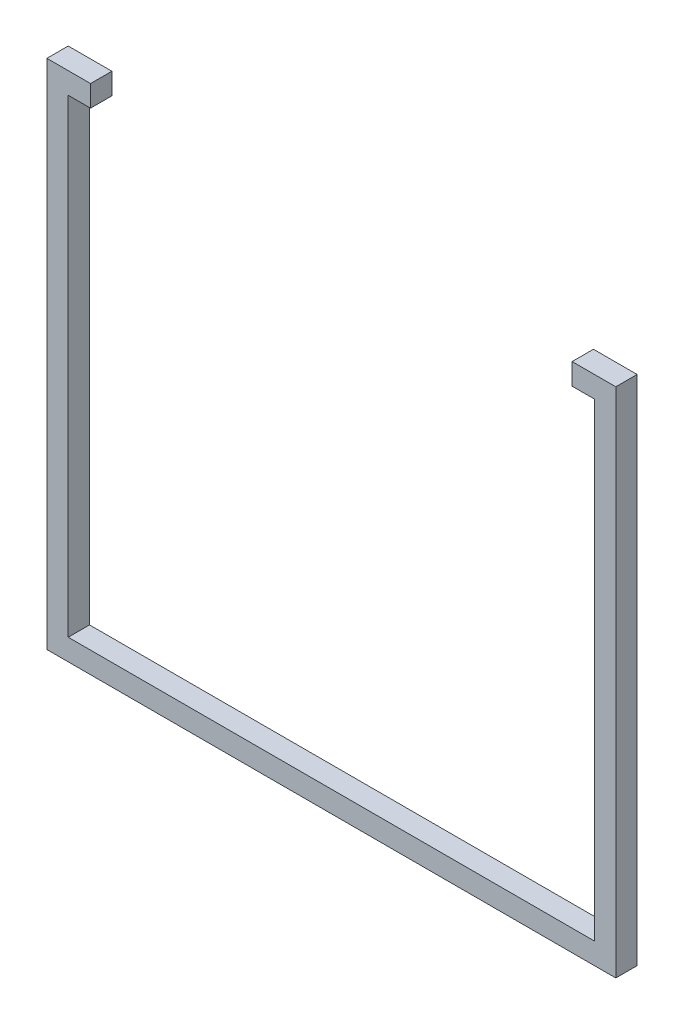
ISO-10303-21;
HEADER;
FILE_DESCRIPTION(('STEP AP214'),'2;1');
FILE_NAME('part.step','',(''),(''),'','','');
FILE_SCHEMA(('AUTOMOTIVE_DESIGN { 1 0 10303 214 1 1 1 1 }'));
ENDSEC;
DATA;
#1=APPLICATION_CONTEXT('core data for automotive mechanical design processes');
#2=APPLICATION_PROTOCOL_DEFINITION('international standard','automotive_design',2000,#1);
#3=PRODUCT_CONTEXT('',#1,'mechanical');
#4=PRODUCT('Part','Part','',(#3));
#5=PRODUCT_RELATED_PRODUCT_CATEGORY('part','',(#4));
#6=PRODUCT_DEFINITION_FORMATION('','',#4);
#7=PRODUCT_DEFINITION_CONTEXT('part definition',#1,'design');
#8=PRODUCT_DEFINITION('design','',#6,#7);
#9=PRODUCT_DEFINITION_SHAPE('','',#8);
#10=(LENGTH_UNIT() NAMED_UNIT(*) SI_UNIT(.MILLI.,.METRE.));
#11=(NAMED_UNIT(*) PLANE_ANGLE_UNIT() SI_UNIT($,.RADIAN.));
#12=(NAMED_UNIT(*) SI_UNIT($,.STERADIAN.) SOLID_ANGLE_UNIT());
#13=UNCERTAINTY_MEASURE_WITH_UNIT(LENGTH_MEASURE(1.E-05),#10,'distance_accuracy_value','');
#14=(GEOMETRIC_REPRESENTATION_CONTEXT(3) GLOBAL_UNCERTAINTY_ASSIGNED_CONTEXT((#13)) GLOBAL_UNIT_ASSIGNED_CONTEXT((#10,
#11,#12)) REPRESENTATION_CONTEXT('',''));
#15=CARTESIAN_POINT('',(0.,0.,0.));
#16=DIRECTION('',(0.,0.,1.));
#17=DIRECTION('',(1.,0.,0.));
#18=AXIS2_PLACEMENT_3D('',#15,#16,#17);
#19=CARTESIAN_POINT('',(0.,457.2,19.05));
#20=DIRECTION('',(0.,-1.,0.));
#21=DIRECTION('',(0.,0.,-1.));
#22=AXIS2_PLACEMENT_3D('',#19,#20,#21);
#23=PLANE('',#22);
#24=DIRECTION('',(-1.,0.,0.));
#25=VECTOR('',#24,1.);
#26=CARTESIAN_POINT('',(0.,457.2,0.));
#27=LINE('',#26,#25);
#28=CARTESIAN_POINT('',(508.,457.2,0.));
#29=VERTEX_POINT('',#28);
#30=CARTESIAN_POINT('',(469.,457.2,0.));
#31=VERTEX_POINT('',#30);
#32=EDGE_CURVE('E136',#29,#31,#27,.T.);
#33=ORIENTED_EDGE('',*,*,#32,.T.);
#34=DIRECTION('',(0.,0.,1.));
#35=VECTOR('',#34,1.);
#36=CARTESIAN_POINT('',(469.,457.2,0.));
#37=LINE('',#36,#35);
#38=CARTESIAN_POINT('',(469.,457.2,19.05));
#39=VERTEX_POINT('',#38);
#40=EDGE_CURVE('E120',#31,#39,#37,.T.);
#41=ORIENTED_EDGE('',*,*,#40,.T.);
#42=DIRECTION('',(-1.,0.,0.));
#43=VECTOR('',#42,1.);
#44=CARTESIAN_POINT('',(0.,457.2,19.05));
#45=LINE('',#44,#43);
#46=CARTESIAN_POINT('',(508.,457.2,19.05));
#47=VERTEX_POINT('',#46);
#48=EDGE_CURVE('E157',#47,#39,#45,.T.);
#49=ORIENTED_EDGE('',*,*,#48,.F.);
#50=DIRECTION('',(0.,0.,-1.));
#51=VECTOR('',#50,1.);
#52=CARTESIAN_POINT('',(508.,457.2,19.05));
#53=LINE('',#52,#51);
#54=EDGE_CURVE('E143',#47,#29,#53,.T.);
#55=ORIENTED_EDGE('',*,*,#54,.T.);
#56=EDGE_LOOP('',(#33,#41,#49,#55));
#57=FACE_BOUND('',#56,.T.);
#58=ADVANCED_FACE('F33',(#57),#23,.F.);
#59=CARTESIAN_POINT('',(19.05,438.15,19.05));
#60=DIRECTION('',(0.,-1.,0.));
#61=DIRECTION('',(0.,0.,-1.));
#62=AXIS2_PLACEMENT_3D('',#59,#60,#61);
#63=PLANE('',#62);
#64=DIRECTION('',(0.,0.,1.));
#65=VECTOR('',#64,1.);
#66=CARTESIAN_POINT('',(469.,438.15,0.));
#67=LINE('',#66,#65);
#68=CARTESIAN_POINT('',(469.,438.15,0.));
#69=VERTEX_POINT('',#68);
#70=CARTESIAN_POINT('',(469.,438.15,19.05));
#71=VERTEX_POINT('',#70);
#72=EDGE_CURVE('E197',#69,#71,#67,.T.);
#73=ORIENTED_EDGE('',*,*,#72,.F.);
#74=DIRECTION('',(-1.,0.,0.));
#75=VECTOR('',#74,1.);
#76=CARTESIAN_POINT('',(19.05,438.15,0.));
#77=LINE('',#76,#75);
#78=CARTESIAN_POINT('',(488.95,438.15,0.));
#79=VERTEX_POINT('',#78);
#80=EDGE_CURVE('E139',#79,#69,#77,.T.);
#81=ORIENTED_EDGE('',*,*,#80,.F.);
#82=DIRECTION('',(0.,0.,-1.));
#83=VECTOR('',#82,1.);
#84=CARTESIAN_POINT('',(488.95,438.15,19.05));
#85=LINE('',#84,#83);
#86=CARTESIAN_POINT('',(488.95,438.15,19.05));
#87=VERTEX_POINT('',#86);
#88=EDGE_CURVE('E180',#87,#79,#85,.T.);
#89=ORIENTED_EDGE('',*,*,#88,.F.);
#90=DIRECTION('',(-1.,0.,0.));
#91=VECTOR('',#90,1.);
#92=CARTESIAN_POINT('',(19.05,438.15,19.05));
#93=LINE('',#92,#91);
#94=EDGE_CURVE('E185',#87,#71,#93,.T.);
#95=ORIENTED_EDGE('',*,*,#94,.T.);
#96=EDGE_LOOP('',(#73,#81,#89,#95));
#97=FACE_BOUND('',#96,.T.);
#98=ADVANCED_FACE('F238',(#97),#63,.T.);
#99=CARTESIAN_POINT('',(0.,0.,19.05));
#100=DIRECTION('',(0.,0.,-1.));
#101=DIRECTION('',(-1.,0.,0.));
#102=AXIS2_PLACEMENT_3D('',#99,#100,#101);
#103=PLANE('',#102);
#104=ORIENTED_EDGE('',*,*,#48,.T.);
#105=DIRECTION('',(0.,1.,0.));
#106=VECTOR('',#105,1.);
#107=CARTESIAN_POINT('',(469.,457.2,19.05));
#108=LINE('',#107,#106);
#109=EDGE_CURVE('E123',#71,#39,#108,.T.);
#110=ORIENTED_EDGE('',*,*,#109,.F.);
#111=ORIENTED_EDGE('',*,*,#94,.F.);
#112=DIRECTION('',(0.,1.,0.));
#113=VECTOR('',#112,1.);
#114=CARTESIAN_POINT('',(488.95,19.05,19.05));
#115=LINE('',#114,#113);
#116=CARTESIAN_POINT('',(488.95,19.05,19.05));
#117=VERTEX_POINT('',#116);
#118=EDGE_CURVE('E201',#117,#87,#115,.T.);
#119=ORIENTED_EDGE('',*,*,#118,.F.);
#120=DIRECTION('',(1.,0.,0.));
#121=VECTOR('',#120,1.);
#122=CARTESIAN_POINT('',(19.05,19.05,19.05));
#123=LINE('',#122,#121);
#124=CARTESIAN_POINT('',(19.05,19.05,19.05));
#125=VERTEX_POINT('',#124);
#126=EDGE_CURVE('E204',#125,#117,#123,.T.);
#127=ORIENTED_EDGE('',*,*,#126,.F.);
#128=DIRECTION('',(0.,-1.,0.));
#129=VECTOR('',#128,1.);
#130=CARTESIAN_POINT('',(19.05,19.05,19.05));
#131=LINE('',#130,#129);
#132=CARTESIAN_POINT('',(19.05,438.15,19.05));
#133=VERTEX_POINT('',#132);
#134=EDGE_CURVE('E187',#133,#125,#131,.T.);
#135=ORIENTED_EDGE('',*,*,#134,.F.);
#136=CARTESIAN_POINT('',(39.,438.15,19.05));
#137=VERTEX_POINT('',#136);
#138=EDGE_CURVE('E200',#137,#133,#93,.T.);
#139=ORIENTED_EDGE('',*,*,#138,.F.);
#140=DIRECTION('',(0.,-1.,0.));
#141=VECTOR('',#140,1.);
#142=CARTESIAN_POINT('',(39.,457.2,19.05));
#143=LINE('',#142,#141);
#144=CARTESIAN_POINT('',(39.,457.2,19.05));
#145=VERTEX_POINT('',#144);
#146=EDGE_CURVE('E48',#145,#137,#143,.T.);
#147=ORIENTED_EDGE('',*,*,#146,.F.);
#148=CARTESIAN_POINT('',(0.,457.2,19.05));
#149=VERTEX_POINT('',#148);
#150=EDGE_CURVE('E173',#145,#149,#45,.T.);
#151=ORIENTED_EDGE('',*,*,#150,.T.);
#152=DIRECTION('',(0.,-1.,0.));
#153=VECTOR('',#152,1.);
#154=CARTESIAN_POINT('',(0.,0.,19.05));
#155=LINE('',#154,#153);
#156=CARTESIAN_POINT('',(0.,0.,19.05));
#157=VERTEX_POINT('',#156);
#158=EDGE_CURVE('E144',#149,#157,#155,.T.);
#159=ORIENTED_EDGE('',*,*,#158,.T.);
#160=DIRECTION('',(1.,0.,0.));
#161=VECTOR('',#160,1.);
#162=CARTESIAN_POINT('',(0.,0.,19.05));
#163=LINE('',#162,#161);
#164=CARTESIAN_POINT('',(508.,0.,19.05));
#165=VERTEX_POINT('',#164);
#166=EDGE_CURVE('E148',#157,#165,#163,.T.);
#167=ORIENTED_EDGE('',*,*,#166,.T.);
#168=DIRECTION('',(0.,1.,0.));
#169=VECTOR('',#168,1.);
#170=CARTESIAN_POINT('',(508.,0.,19.05));
#171=LINE('',#170,#169);
#172=EDGE_CURVE('E163',#165,#47,#171,.T.);
#173=ORIENTED_EDGE('',*,*,#172,.T.);
#174=EDGE_LOOP('',(#104,#110,#111,#119,#127,#135,#139,#147,#151,#159,#167,#173));
#175=FACE_BOUND('',#174,.T.);
#176=ADVANCED_FACE('F228',(#175),#103,.F.);
#177=CARTESIAN_POINT('',(0.,0.,0.));
#178=DIRECTION('',(0.,0.,-1.));
#179=DIRECTION('',(-1.,0.,0.));
#180=AXIS2_PLACEMENT_3D('',#177,#178,#179);
#181=PLANE('',#180);
#182=DIRECTION('',(0.,1.,0.));
#183=VECTOR('',#182,1.);
#184=CARTESIAN_POINT('',(469.,457.2,0.));
#185=LINE('',#184,#183);
#186=EDGE_CURVE('E56',#69,#31,#185,.T.);
#187=ORIENTED_EDGE('',*,*,#186,.T.);
#188=ORIENTED_EDGE('',*,*,#32,.F.);
#189=DIRECTION('',(0.,1.,0.));
#190=VECTOR('',#189,1.);
#191=CARTESIAN_POINT('',(508.,0.,0.));
#192=LINE('',#191,#190);
#193=CARTESIAN_POINT('',(508.,0.,0.));
#194=VERTEX_POINT('',#193);
#195=EDGE_CURVE('E150',#194,#29,#192,.T.);
#196=ORIENTED_EDGE('',*,*,#195,.F.);
#197=DIRECTION('',(1.,0.,0.));
#198=VECTOR('',#197,1.);
#199=CARTESIAN_POINT('',(0.,0.,0.));
#200=LINE('',#199,#198);
#201=CARTESIAN_POINT('',(0.,0.,0.));
#202=VERTEX_POINT('',#201);
#203=EDGE_CURVE('E166',#202,#194,#200,.T.);
#204=ORIENTED_EDGE('',*,*,#203,.F.);
#205=DIRECTION('',(0.,-1.,0.));
#206=VECTOR('',#205,1.);
#207=CARTESIAN_POINT('',(0.,0.,0.));
#208=LINE('',#207,#206);
#209=CARTESIAN_POINT('',(0.,457.2,0.));
#210=VERTEX_POINT('',#209);
#211=EDGE_CURVE('E167',#210,#202,#208,.T.);
#212=ORIENTED_EDGE('',*,*,#211,.F.);
#213=CARTESIAN_POINT('',(39.,457.2,0.));
#214=VERTEX_POINT('',#213);
#215=EDGE_CURVE('E145',#214,#210,#27,.T.);
#216=ORIENTED_EDGE('',*,*,#215,.F.);
#217=DIRECTION('',(0.,-1.,0.));
#218=VECTOR('',#217,1.);
#219=CARTESIAN_POINT('',(39.,457.2,0.));
#220=LINE('',#219,#218);
#221=CARTESIAN_POINT('',(39.,438.15,0.));
#222=VERTEX_POINT('',#221);
#223=EDGE_CURVE('E129',#214,#222,#220,.T.);
#224=ORIENTED_EDGE('',*,*,#223,.T.);
#225=CARTESIAN_POINT('',(19.05,438.15,0.));
#226=VERTEX_POINT('',#225);
#227=EDGE_CURVE('E188',#222,#226,#77,.T.);
#228=ORIENTED_EDGE('',*,*,#227,.T.);
#229=DIRECTION('',(0.,-1.,0.));
#230=VECTOR('',#229,1.);
#231=CARTESIAN_POINT('',(19.05,19.05,0.));
#232=LINE('',#231,#230);
#233=CARTESIAN_POINT('',(19.05,19.05,0.));
#234=VERTEX_POINT('',#233);
#235=EDGE_CURVE('E194',#226,#234,#232,.T.);
#236=ORIENTED_EDGE('',*,*,#235,.T.);
#237=DIRECTION('',(1.,0.,0.));
#238=VECTOR('',#237,1.);
#239=CARTESIAN_POINT('',(19.05,19.05,0.));
#240=LINE('',#239,#238);
#241=CARTESIAN_POINT('',(488.95,19.05,0.));
#242=VERTEX_POINT('',#241);
#243=EDGE_CURVE('E191',#234,#242,#240,.T.);
#244=ORIENTED_EDGE('',*,*,#243,.T.);
#245=DIRECTION('',(0.,1.,0.));
#246=VECTOR('',#245,1.);
#247=CARTESIAN_POINT('',(488.95,19.05,0.));
#248=LINE('',#247,#246);
#249=EDGE_CURVE('E189',#242,#79,#248,.T.);
#250=ORIENTED_EDGE('',*,*,#249,.T.);
#251=ORIENTED_EDGE('',*,*,#80,.T.);
#252=EDGE_LOOP('',(#187,#188,#196,#204,#212,#216,#224,#228,#236,#244,#250,#251));
#253=FACE_BOUND('',#252,.T.);
#254=ADVANCED_FACE('F134',(#253),#181,.T.);
#255=CARTESIAN_POINT('',(0.,0.,19.05));
#256=DIRECTION('',(1.,0.,0.));
#257=DIRECTION('',(0.,0.,-1.));
#258=AXIS2_PLACEMENT_3D('',#255,#256,#257);
#259=PLANE('',#258);
#260=ORIENTED_EDGE('',*,*,#211,.T.);
#261=DIRECTION('',(0.,0.,-1.));
#262=VECTOR('',#261,1.);
#263=CARTESIAN_POINT('',(0.,0.,19.05));
#264=LINE('',#263,#262);
#265=EDGE_CURVE('E11',#157,#202,#264,.T.);
#266=ORIENTED_EDGE('',*,*,#265,.F.);
#267=ORIENTED_EDGE('',*,*,#158,.F.);
#268=DIRECTION('',(0.,0.,-1.));
#269=VECTOR('',#268,1.);
#270=CARTESIAN_POINT('',(0.,457.2,19.05));
#271=LINE('',#270,#269);
#272=EDGE_CURVE('E154',#149,#210,#271,.T.);
#273=ORIENTED_EDGE('',*,*,#272,.T.);
#274=EDGE_LOOP('',(#260,#266,#267,#273));
#275=FACE_BOUND('',#274,.T.);
#276=ADVANCED_FACE('F35',(#275),#259,.F.);
#277=CARTESIAN_POINT('',(0.,0.,19.05));
#278=DIRECTION('',(0.,1.,0.));
#279=DIRECTION('',(0.,0.,1.));
#280=AXIS2_PLACEMENT_3D('',#277,#278,#279);
#281=PLANE('',#280);
#282=ORIENTED_EDGE('',*,*,#203,.T.);
#283=DIRECTION('',(0.,0.,-1.));
#284=VECTOR('',#283,1.);
#285=CARTESIAN_POINT('',(508.,0.,19.05));
#286=LINE('',#285,#284);
#287=EDGE_CURVE('E41',#165,#194,#286,.T.);
#288=ORIENTED_EDGE('',*,*,#287,.F.);
#289=ORIENTED_EDGE('',*,*,#166,.F.);
#290=ORIENTED_EDGE('',*,*,#265,.T.);
#291=EDGE_LOOP('',(#282,#288,#289,#290));
#292=FACE_BOUND('',#291,.T.);
#293=ADVANCED_FACE('F241',(#292),#281,.F.);
#294=CARTESIAN_POINT('',(508.,0.,19.05));
#295=DIRECTION('',(-1.,0.,0.));
#296=DIRECTION('',(0.,0.,1.));
#297=AXIS2_PLACEMENT_3D('',#294,#295,#296);
#298=PLANE('',#297);
#299=ORIENTED_EDGE('',*,*,#195,.T.);
#300=ORIENTED_EDGE('',*,*,#54,.F.);
#301=ORIENTED_EDGE('',*,*,#172,.F.);
#302=ORIENTED_EDGE('',*,*,#287,.T.);
#303=EDGE_LOOP('',(#299,#300,#301,#302));
#304=FACE_BOUND('',#303,.T.);
#305=ADVANCED_FACE('F162',(#304),#298,.F.);
#306=ORIENTED_EDGE('',*,*,#150,.F.);
#307=DIRECTION('',(0.,0.,1.));
#308=VECTOR('',#307,1.);
#309=CARTESIAN_POINT('',(39.,457.2,0.));
#310=LINE('',#309,#308);
#311=EDGE_CURVE('E128',#214,#145,#310,.T.);
#312=ORIENTED_EDGE('',*,*,#311,.F.);
#313=ORIENTED_EDGE('',*,*,#215,.T.);
#314=ORIENTED_EDGE('',*,*,#272,.F.);
#315=EDGE_LOOP('',(#306,#312,#313,#314));
#316=FACE_BOUND('',#315,.T.);
#317=ADVANCED_FACE('F246',(#316),#23,.F.);
#318=CARTESIAN_POINT('',(19.05,19.05,19.05));
#319=DIRECTION('',(1.,0.,0.));
#320=DIRECTION('',(0.,0.,-1.));
#321=AXIS2_PLACEMENT_3D('',#318,#319,#320);
#322=PLANE('',#321);
#323=ORIENTED_EDGE('',*,*,#235,.F.);
#324=DIRECTION('',(0.,0.,-1.));
#325=VECTOR('',#324,1.);
#326=CARTESIAN_POINT('',(19.05,438.15,19.05));
#327=LINE('',#326,#325);
#328=EDGE_CURVE('E182',#133,#226,#327,.T.);
#329=ORIENTED_EDGE('',*,*,#328,.F.);
#330=ORIENTED_EDGE('',*,*,#134,.T.);
#331=DIRECTION('',(0.,0.,-1.));
#332=VECTOR('',#331,1.);
#333=CARTESIAN_POINT('',(19.05,19.05,19.05));
#334=LINE('',#333,#332);
#335=EDGE_CURVE('E169',#125,#234,#334,.T.);
#336=ORIENTED_EDGE('',*,*,#335,.T.);
#337=EDGE_LOOP('',(#323,#329,#330,#336));
#338=FACE_BOUND('',#337,.T.);
#339=ADVANCED_FACE('F224',(#338),#322,.T.);
#340=CARTESIAN_POINT('',(19.05,19.05,19.05));
#341=DIRECTION('',(0.,1.,0.));
#342=DIRECTION('',(0.,0.,1.));
#343=AXIS2_PLACEMENT_3D('',#340,#341,#342);
#344=PLANE('',#343);
#345=ORIENTED_EDGE('',*,*,#243,.F.);
#346=ORIENTED_EDGE('',*,*,#335,.F.);
#347=ORIENTED_EDGE('',*,*,#126,.T.);
#348=DIRECTION('',(0.,0.,-1.));
#349=VECTOR('',#348,1.);
#350=CARTESIAN_POINT('',(488.95,19.05,19.05));
#351=LINE('',#350,#349);
#352=EDGE_CURVE('E178',#117,#242,#351,.T.);
#353=ORIENTED_EDGE('',*,*,#352,.T.);
#354=EDGE_LOOP('',(#345,#346,#347,#353));
#355=FACE_BOUND('',#354,.T.);
#356=ADVANCED_FACE('F233',(#355),#344,.T.);
#357=CARTESIAN_POINT('',(488.95,19.05,19.05));
#358=DIRECTION('',(-1.,0.,0.));
#359=DIRECTION('',(0.,0.,1.));
#360=AXIS2_PLACEMENT_3D('',#357,#358,#359);
#361=PLANE('',#360);
#362=ORIENTED_EDGE('',*,*,#249,.F.);
#363=ORIENTED_EDGE('',*,*,#352,.F.);
#364=ORIENTED_EDGE('',*,*,#118,.T.);
#365=ORIENTED_EDGE('',*,*,#88,.T.);
#366=EDGE_LOOP('',(#362,#363,#364,#365));
#367=FACE_BOUND('',#366,.T.);
#368=ADVANCED_FACE('F236',(#367),#361,.T.);
#369=DIRECTION('',(0.,0.,1.));
#370=VECTOR('',#369,1.);
#371=CARTESIAN_POINT('',(39.,438.15,0.));
#372=LINE('',#371,#370);
#373=EDGE_CURVE('E208',#222,#137,#372,.T.);
#374=ORIENTED_EDGE('',*,*,#373,.T.);
#375=ORIENTED_EDGE('',*,*,#138,.T.);
#376=ORIENTED_EDGE('',*,*,#328,.T.);
#377=ORIENTED_EDGE('',*,*,#227,.F.);
#378=EDGE_LOOP('',(#374,#375,#376,#377));
#379=FACE_BOUND('',#378,.T.);
#380=ADVANCED_FACE('F219',(#379),#63,.T.);
#381=CARTESIAN_POINT('',(39.,457.2,0.));
#382=DIRECTION('',(-1.,0.,0.));
#383=DIRECTION('',(0.,0.,1.));
#384=AXIS2_PLACEMENT_3D('',#381,#382,#383);
#385=PLANE('',#384);
#386=ORIENTED_EDGE('',*,*,#146,.T.);
#387=ORIENTED_EDGE('',*,*,#373,.F.);
#388=ORIENTED_EDGE('',*,*,#223,.F.);
#389=ORIENTED_EDGE('',*,*,#311,.T.);
#390=EDGE_LOOP('',(#386,#387,#388,#389));
#391=FACE_BOUND('',#390,.T.);
#392=ADVANCED_FACE('F247',(#391),#385,.F.);
#393=CARTESIAN_POINT('',(469.,457.2,0.));
#394=DIRECTION('',(1.,0.,0.));
#395=DIRECTION('',(0.,0.,-1.));
#396=AXIS2_PLACEMENT_3D('',#393,#394,#395);
#397=PLANE('',#396);
#398=ORIENTED_EDGE('',*,*,#109,.T.);
#399=ORIENTED_EDGE('',*,*,#40,.F.);
#400=ORIENTED_EDGE('',*,*,#186,.F.);
#401=ORIENTED_EDGE('',*,*,#72,.T.);
#402=EDGE_LOOP('',(#398,#399,#400,#401));
#403=FACE_BOUND('',#402,.T.);
#404=ADVANCED_FACE('F121',(#403),#397,.F.);
#405=CLOSED_SHELL('',(#58,#98,#176,#254,#276,#293,#305,#317,#339,#356,#368,#380,#392,#404));
#406=MANIFOLD_SOLID_BREP('B2',#405);
#407=ADVANCED_BREP_SHAPE_REPRESENTATION('',(#18,#406),#14);
#408=SHAPE_DEFINITION_REPRESENTATION(#9,#407);
ENDSEC;
END-ISO-10303-21;
